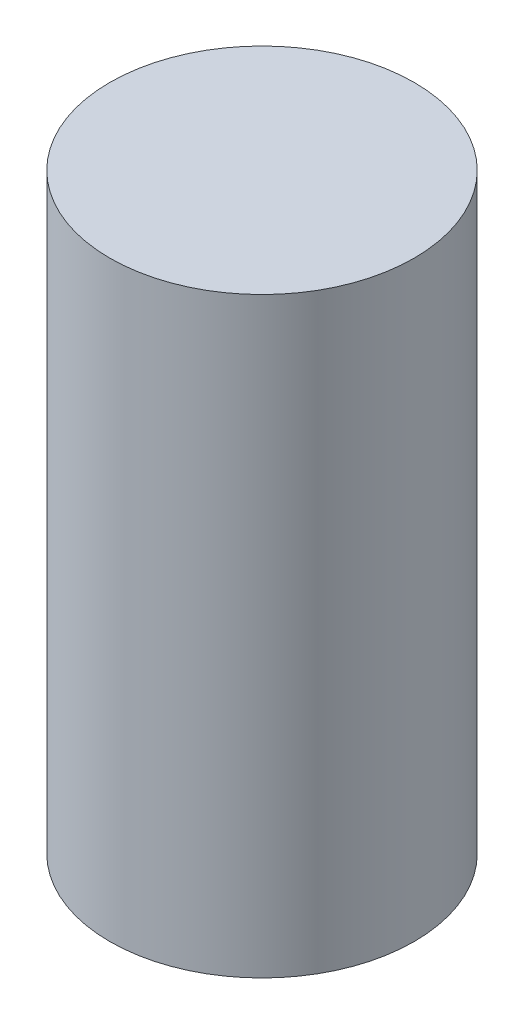
ISO-10303-21;
HEADER;
FILE_DESCRIPTION(('STEP AP214'),'2;1');
FILE_NAME('part.step','',(''),(''),'','','');
FILE_SCHEMA(('AUTOMOTIVE_DESIGN { 1 0 10303 214 1 1 1 1 }'));
ENDSEC;
DATA;
#1=APPLICATION_CONTEXT('core data for automotive mechanical design processes');
#2=APPLICATION_PROTOCOL_DEFINITION('international standard','automotive_design',2000,#1);
#3=PRODUCT_CONTEXT('',#1,'mechanical');
#4=PRODUCT('Part','Part','',(#3));
#5=PRODUCT_RELATED_PRODUCT_CATEGORY('part','',(#4));
#6=PRODUCT_DEFINITION_FORMATION('','',#4);
#7=PRODUCT_DEFINITION_CONTEXT('part definition',#1,'design');
#8=PRODUCT_DEFINITION('design','',#6,#7);
#9=PRODUCT_DEFINITION_SHAPE('','',#8);
#10=(LENGTH_UNIT() NAMED_UNIT(*) SI_UNIT(.MILLI.,.METRE.));
#11=(NAMED_UNIT(*) PLANE_ANGLE_UNIT() SI_UNIT($,.RADIAN.));
#12=(NAMED_UNIT(*) SI_UNIT($,.STERADIAN.) SOLID_ANGLE_UNIT());
#13=UNCERTAINTY_MEASURE_WITH_UNIT(LENGTH_MEASURE(1.E-05),#10,'distance_accuracy_value','');
#14=(GEOMETRIC_REPRESENTATION_CONTEXT(3) GLOBAL_UNCERTAINTY_ASSIGNED_CONTEXT((#13)) GLOBAL_UNIT_ASSIGNED_CONTEXT((#10,
#11,#12)) REPRESENTATION_CONTEXT('',''));
#15=CARTESIAN_POINT('',(0.,0.,0.));
#16=DIRECTION('',(0.,0.,1.));
#17=DIRECTION('',(1.,0.,0.));
#18=AXIS2_PLACEMENT_3D('',#15,#16,#17);
#19=CARTESIAN_POINT('',(0.,35.,0.));
#20=DIRECTION('',(0.,-1.,0.));
#21=DIRECTION('',(0.,0.,-1.));
#22=AXIS2_PLACEMENT_3D('',#19,#20,#21);
#23=CYLINDRICAL_SURFACE('',#22,9.);
#24=CARTESIAN_POINT('',(0.,35.,0.));
#25=DIRECTION('',(0.,1.,0.));
#26=DIRECTION('',(0.,0.,1.));
#27=AXIS2_PLACEMENT_3D('',#24,#25,#26);
#28=CIRCLE('',#27,9.);
#29=CARTESIAN_POINT('',(0.,35.,9.));
#30=VERTEX_POINT('',#29);
#31=EDGE_CURVE('E10',#30,#30,#28,.T.);
#32=ORIENTED_EDGE('',*,*,#31,.F.);
#33=EDGE_LOOP('',(#32));
#34=FACE_BOUND('',#33,.T.);
#35=CARTESIAN_POINT('',(0.,0.,0.));
#36=DIRECTION('',(0.,1.,0.));
#37=DIRECTION('',(0.,0.,1.));
#38=AXIS2_PLACEMENT_3D('',#35,#36,#37);
#39=CIRCLE('',#38,9.);
#40=CARTESIAN_POINT('',(0.,0.,9.));
#41=VERTEX_POINT('',#40);
#42=EDGE_CURVE('E42',#41,#41,#39,.T.);
#43=ORIENTED_EDGE('',*,*,#42,.T.);
#44=EDGE_LOOP('',(#43));
#45=FACE_BOUND('',#44,.T.);
#46=ADVANCED_FACE('F39',(#34,#45),#23,.T.);
#47=CARTESIAN_POINT('',(0.,35.,0.));
#48=DIRECTION('',(0.,1.,0.));
#49=DIRECTION('',(0.,0.,1.));
#50=AXIS2_PLACEMENT_3D('',#47,#48,#49);
#51=PLANE('',#50);
#52=ORIENTED_EDGE('',*,*,#31,.T.);
#53=EDGE_LOOP('',(#52));
#54=FACE_BOUND('',#53,.T.);
#55=ADVANCED_FACE('F54',(#54),#51,.T.);
#56=CARTESIAN_POINT('',(0.,0.,0.));
#57=DIRECTION('',(0.,1.,0.));
#58=DIRECTION('',(0.,0.,1.));
#59=AXIS2_PLACEMENT_3D('',#56,#57,#58);
#60=PLANE('',#59);
#61=ORIENTED_EDGE('',*,*,#42,.F.);
#62=EDGE_LOOP('',(#61));
#63=FACE_BOUND('',#62,.T.);
#64=ADVANCED_FACE('F52',(#63),#60,.F.);
#65=CLOSED_SHELL('',(#46,#55,#64));
#66=MANIFOLD_SOLID_BREP('B2',#65);
#67=ADVANCED_BREP_SHAPE_REPRESENTATION('',(#18,#66),#14);
#68=SHAPE_DEFINITION_REPRESENTATION(#9,#67);
ENDSEC;
END-ISO-10303-21;
